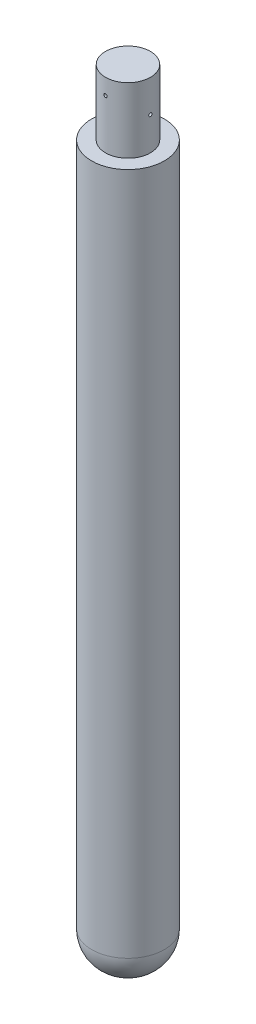
ISO-10303-21;
HEADER;
FILE_DESCRIPTION(('STEP AP214'),'2;1');
FILE_NAME('part.step','',(''),(''),'','','');
FILE_SCHEMA(('AUTOMOTIVE_DESIGN { 1 0 10303 214 1 1 1 1 }'));
ENDSEC;
DATA;
#1=APPLICATION_CONTEXT('core data for automotive mechanical design processes');
#2=APPLICATION_PROTOCOL_DEFINITION('international standard','automotive_design',2000,#1);
#3=PRODUCT_CONTEXT('',#1,'mechanical');
#4=PRODUCT('Part','Part','',(#3));
#5=PRODUCT_RELATED_PRODUCT_CATEGORY('part','',(#4));
#6=PRODUCT_DEFINITION_FORMATION('','',#4);
#7=PRODUCT_DEFINITION_CONTEXT('part definition',#1,'design');
#8=PRODUCT_DEFINITION('design','',#6,#7);
#9=PRODUCT_DEFINITION_SHAPE('','',#8);
#10=(LENGTH_UNIT() NAMED_UNIT(*) SI_UNIT(.MILLI.,.METRE.));
#11=(NAMED_UNIT(*) PLANE_ANGLE_UNIT() SI_UNIT($,.RADIAN.));
#12=(NAMED_UNIT(*) SI_UNIT($,.STERADIAN.) SOLID_ANGLE_UNIT());
#13=UNCERTAINTY_MEASURE_WITH_UNIT(LENGTH_MEASURE(1.E-05),#10,'distance_accuracy_value','');
#14=(GEOMETRIC_REPRESENTATION_CONTEXT(3) GLOBAL_UNCERTAINTY_ASSIGNED_CONTEXT((#13)) GLOBAL_UNIT_ASSIGNED_CONTEXT((#10,
#11,#12)) REPRESENTATION_CONTEXT('',''));
#15=CARTESIAN_POINT('',(0.,0.,0.));
#16=DIRECTION('',(0.,0.,1.));
#17=DIRECTION('',(1.,0.,0.));
#18=AXIS2_PLACEMENT_3D('',#15,#16,#17);
#19=CARTESIAN_POINT('',(0.,236.46667,0.));
#20=DIRECTION('',(0.,-1.,0.));
#21=DIRECTION('',(0.,0.,-1.));
#22=AXIS2_PLACEMENT_3D('',#19,#20,#21);
#23=CYLINDRICAL_SURFACE('',#22,6.8);
#24=CARTESIAN_POINT('',(-6.78159273327439,226.66667,-0.500000000000003));
#25=CARTESIAN_POINT('',(-6.78159297837757,226.6947144594,-0.499998770231773));
#26=CARTESIAN_POINT('',(-6.78176856677654,226.722778286839,-0.497632591546759));
#27=CARTESIAN_POINT('',(-6.78245198649018,226.778130251371,-0.488227838713539));
#28=CARTESIAN_POINT('',(-6.78296019944658,226.805417459827,-0.481183897328644));
#29=CARTESIAN_POINT('',(-6.78425099555627,226.858406442766,-0.462627731505162));
#30=CARTESIAN_POINT('',(-6.78503342856656,226.884109075812,-0.45111795186696));
#31=CARTESIAN_POINT('',(-6.78678431460583,226.933211144203,-0.423960985491659));
#32=CARTESIAN_POINT('',(-6.78775272642473,226.956611088056,-0.408314715049562));
#33=CARTESIAN_POINT('',(-6.78976866583827,227.000497428313,-0.373294420232593));
#34=CARTESIAN_POINT('',(-6.79081633232312,227.020978519599,-0.353913755066674));
#35=CARTESIAN_POINT('',(-6.79287145399055,227.058400269882,-0.311988733735704));
#36=CARTESIAN_POINT('',(-6.79387890745549,227.075340777778,-0.289444242616633));
#37=CARTESIAN_POINT('',(-6.79574135636166,227.105217562981,-0.241800601139886));
#38=CARTESIAN_POINT('',(-6.79659617984393,227.118149335811,-0.216698618778854));
#39=CARTESIAN_POINT('',(-6.79805556933641,227.139612743824,-0.164672353745901));
#40=CARTESIAN_POINT('',(-6.79866013886455,227.148144440863,-0.137748096696646));
#41=CARTESIAN_POINT('',(-6.79954993521933,227.160550477922,-0.0828936605519977));
#42=CARTESIAN_POINT('',(-6.79983574266283,227.164433286724,-0.0549654063471341));
#43=CARTESIAN_POINT('',(-6.80005777399104,227.167457495318,0.00114779135176697));
#44=CARTESIAN_POINT('',(-6.79999400308205,227.166598965722,0.0293327310167222));
#45=CARTESIAN_POINT('',(-6.79952454466821,227.160171822787,0.0851018411694216));
#46=CARTESIAN_POINT('',(-6.79911951834028,227.154612317439,0.112687067651171));
#47=CARTESIAN_POINT('',(-6.79801388751421,227.138955185032,0.166531741703012));
#48=CARTESIAN_POINT('',(-6.79731328073735,227.128857522987,0.192791179050389));
#49=CARTESIAN_POINT('',(-6.79569420149225,227.104400479208,0.243267979866799));
#50=CARTESIAN_POINT('',(-6.79477551941266,227.09003699386,0.267483348055107));
#51=CARTESIAN_POINT('',(-6.79282360632603,227.057459011694,0.313162842512627));
#52=CARTESIAN_POINT('',(-6.79179037351871,227.039244454349,0.334626925531555));
#53=CARTESIAN_POINT('',(-6.78972267451368,226.999429985177,0.374247769142871));
#54=CARTESIAN_POINT('',(-6.78868821118392,226.977822163606,0.392396582431207));
#55=CARTESIAN_POINT('',(-6.78673711523689,226.931862171376,0.424810372711896));
#56=CARTESIAN_POINT('',(-6.78582048268846,226.907509999112,0.43907534743491));
#57=CARTESIAN_POINT('',(-6.78420861400634,226.856747260943,0.463316094783634));
#58=CARTESIAN_POINT('',(-6.78351339713152,226.83033651623,0.473291494325563));
#59=CARTESIAN_POINT('',(-6.78242339907657,226.776208823244,0.488664243993162));
#60=CARTESIAN_POINT('',(-6.7820286129932,226.748491896297,0.494061668834622));
#61=CARTESIAN_POINT('',(-6.78158492474778,226.692608051427,0.500115276160827));
#62=CARTESIAN_POINT('',(-6.78153521539852,226.664442338217,0.500782523331512));
#63=CARTESIAN_POINT('',(-6.78178517593299,226.60839942571,0.497385780829759));
#64=CARTESIAN_POINT('',(-6.78208484328886,226.580522224328,0.493321825389036));
#65=CARTESIAN_POINT('',(-6.78299905331064,226.525879190008,0.480587245964444));
#66=CARTESIAN_POINT('',(-6.78361324534929,226.499112155315,0.471921751308704));
#67=CARTESIAN_POINT('',(-6.78508700233736,226.447412112612,0.450235279473719));
#68=CARTESIAN_POINT('',(-6.78594657036215,226.422479127592,0.437214247704794));
#69=CARTESIAN_POINT('',(-6.78781617977533,226.375104209245,0.407158182314458));
#70=CARTESIAN_POINT('',(-6.78882649706358,226.35266697787,0.390115754806744));
#71=CARTESIAN_POINT('',(-6.79088281220847,226.310967920048,0.352511390028029));
#72=CARTESIAN_POINT('',(-6.79192881054459,226.291706136291,0.331949405448091));
#73=CARTESIAN_POINT('',(-6.79394100886642,226.256867175691,0.287841888640223));
#74=CARTESIAN_POINT('',(-6.79490705113871,226.241297173206,0.264290681464511));
#75=CARTESIAN_POINT('',(-6.79664822050773,226.214332907777,0.214901657852376));
#76=CARTESIAN_POINT('',(-6.79742334914581,226.202938611121,0.189063859879152));
#77=CARTESIAN_POINT('',(-6.7986946168929,226.184661601532,0.135861139830734));
#78=CARTESIAN_POINT('',(-6.79919103352641,226.177774399572,0.108497766791575));
#79=CARTESIAN_POINT('',(-6.7998500618275,226.168692400326,0.0529992515100641));
#80=CARTESIAN_POINT('',(-6.80001267827624,226.16649753583,0.0248641203277486));
#81=CARTESIAN_POINT('',(-6.79998579508498,226.166863226587,-0.0313083985646522));
#82=CARTESIAN_POINT('',(-6.79979712504935,226.169412577808,-0.059345860296129));
#83=CARTESIAN_POINT('',(-6.79909051843197,226.179171036077,-0.114593381986072));
#84=CARTESIAN_POINT('',(-6.79857258132922,226.1863801505,-0.141803440635282));
#85=CARTESIAN_POINT('',(-6.79726560326606,226.205250795847,-0.194624944412667));
#86=CARTESIAN_POINT('',(-6.79647657014824,226.216912197971,-0.220236435760865));
#87=CARTESIAN_POINT('',(-6.79471583354579,226.244355010418,-0.269139744831946));
#88=CARTESIAN_POINT('',(-6.79374413388129,226.260136334581,-0.292431611050076));
#89=CARTESIAN_POINT('',(-6.79172451801548,226.295412890635,-0.336091669932223));
#90=CARTESIAN_POINT('',(-6.7906764362776,226.314916346633,-0.356453209880313));
#91=CARTESIAN_POINT('',(-6.78862356662167,226.357070065518,-0.393621074326443));
#92=CARTESIAN_POINT('',(-6.78761878930475,226.379721093277,-0.410426532172276));
#93=CARTESIAN_POINT('',(-6.78576458384905,226.42756169053,-0.440022648082056));
#94=CARTESIAN_POINT('',(-6.78491539882182,226.452755138886,-0.452807045234638));
#95=CARTESIAN_POINT('',(-6.78347155374233,226.504919460085,-0.473948321363642));
#96=CARTESIAN_POINT('',(-6.78287659844061,226.531888228904,-0.482310338964581));
#97=CARTESIAN_POINT('',(-6.78216306649953,226.576960950742,-0.492217618601718));
#98=CARTESIAN_POINT('',(-6.78195016075426,226.594774246929,-0.495132185938419));
#99=CARTESIAN_POINT('',(-6.78166491548103,226.630612359725,-0.499023770068944));
#100=CARTESIAN_POINT('',(-6.78159257567097,226.648637175909,-0.500000790751353));
#101=CARTESIAN_POINT('',(-6.78159273327439,226.66667,-0.500000000000003));
#102=B_SPLINE_CURVE_WITH_KNOTS('',3,(#24,#25,#26,#27,#28,#29,#30,#31,#32,#33,#34,#35,#36,#37,
#38,#39,#40,#41,#42,#43,#44,#45,#46,#47,#48,#49,#50,#51,#52,#53,#54,#55,#56,#57,#58,#59,#60,#61,
#62,#63,#64,#65,#66,#67,#68,#69,#70,#71,#72,#73,#74,#75,#76,#77,#78,#79,#80,#81,#82,#83,#84,#85,
#86,#87,#88,#89,#90,#91,#92,#93,#94,#95,#96,#97,#98,#99,#100,#101),.UNSPECIFIED.,.T.,.F.,(4,2,2,
2,2,2,2,2,2,2,2,2,2,2,2,2,2,2,2,2,2,2,2,2,2,2,2,2,2,2,2,2,2,2,2,2,2,2,4),(0.,0.084067542244147,
0.168231710124494,0.25234986762154,0.33644940726993,0.420699902967313,0.50495399348977,
0.589302417128914,0.673649655006859,0.757843004383307,0.842035099863553,0.9260644486161,
1.01009444519175,1.09420553978808,1.17831795645116,1.26262943303786,1.34694095888795,
1.43125981621085,1.51557729736375,1.59969748038507,1.68381705477462,1.7678430574443,
1.85187011328479,1.93605288503218,2.02023678843055,2.10458297232425,2.18892847522237,
2.27318984236082,2.35745000258294,2.44151142487004,2.52557298016638,2.60963210383002,
2.69368946974239,2.77793475820918,2.86220055449528,2.94659691296704,3.03089498965295,
3.08495123733824,3.13900737653456),.UNSPECIFIED.);
#103=CARTESIAN_POINT('',(-6.78159273327439,226.66667,-0.500000000000003));
#104=VERTEX_POINT('',#103);
#105=EDGE_CURVE('E116',#104,#104,#102,.T.);
#106=ORIENTED_EDGE('',*,*,#105,.T.);
#107=EDGE_LOOP('',(#106));
#108=FACE_BOUND('',#107,.T.);
#109=CARTESIAN_POINT('',(0.,232.16667,-6.8));
#110=CARTESIAN_POINT('',(-0.0280445749603988,232.166668770336,-6.7999997573507));
#111=CARTESIAN_POINT('',(-0.0561085175768542,232.16430257281,-6.79982465525674));
#112=CARTESIAN_POINT('',(-0.111460721427836,232.154897738334,-6.7991429730326));
#113=CARTESIAN_POINT('',(-0.138748054114419,232.147853734541,-6.79863601217077));
#114=CARTESIAN_POINT('',(-0.191737299690093,232.129297386137,-6.79734793276696));
#115=CARTESIAN_POINT('',(-0.217440070088096,232.117787483353,-6.79656696406701));
#116=CARTESIAN_POINT('',(-0.266542368418331,232.09063022702,-6.79481857968268));
#117=CARTESIAN_POINT('',(-0.289942405030519,232.074983790069,-6.79385120531611));
#118=CARTESIAN_POINT('',(-0.333828639715717,232.039963327401,-6.79183647283731));
#119=CARTESIAN_POINT('',(-0.354309562247897,232.020582698058,-6.79078897504196));
#120=CARTESIAN_POINT('',(-0.391730987072271,231.978657819116,-6.78873323672079));
#121=CARTESIAN_POINT('',(-0.408671337745742,231.956113434104,-6.78772499787767));
#122=CARTESIAN_POINT('',(-0.438547959189983,231.908469884771,-6.78586035990913));
#123=CARTESIAN_POINT('',(-0.451479696425917,231.883367870207,-6.78500413316556));
#124=CARTESIAN_POINT('',(-0.472943029739613,231.83134153516,-6.78354194311983));
#125=CARTESIAN_POINT('',(-0.481474688098939,231.804417240476,-6.78293597627536));
#126=CARTESIAN_POINT('',(-0.493880643373556,231.749562692463,-6.78204400808108));
#127=CARTESIAN_POINT('',(-0.497763406015041,231.72163436336,-6.78175742519321));
#128=CARTESIAN_POINT('',(-0.500787496340066,231.665521019259,-6.78153480408504));
#129=CARTESIAN_POINT('',(-0.499928895129025,231.637336008118,-6.78159876060777));
#130=CARTESIAN_POINT('',(-0.493501639519712,231.581567215702,-6.78206946645491));
#131=CARTESIAN_POINT('',(-0.487942165181557,231.553982370017,-6.78247554765846));
#132=CARTESIAN_POINT('',(-0.472285227066322,231.500138441572,-6.78358369429947));
#133=CARTESIAN_POINT('',(-0.462187727608019,231.473879369238,-6.7842857620642));
#134=CARTESIAN_POINT('',(-0.437731019011254,231.423403008138,-6.78590753973363));
#135=CARTESIAN_POINT('',(-0.423367668081685,231.399187733209,-6.78682746097947));
#136=CARTESIAN_POINT('',(-0.390789972023455,231.353508368124,-6.78878108294084));
#137=CARTESIAN_POINT('',(-0.37257556644531,231.332044321161,-6.78981478544226));
#138=CARTESIAN_POINT('',(-0.332761204047051,231.292423303474,-6.79188245893446));
#139=CARTESIAN_POINT('',(-0.311153306722498,231.274274310773,-6.79291642472856));
#140=CARTESIAN_POINT('',(-0.265193099321131,231.241860194727,-6.79486576445203));
#141=CARTESIAN_POINT('',(-0.240840787898321,231.227595073288,-6.79578113832322));
#142=CARTESIAN_POINT('',(-0.190078013898727,231.203354220721,-6.7973902718425));
#143=CARTESIAN_POINT('',(-0.163667394385234,231.193378817045,-6.79808401457162));
#144=CARTESIAN_POINT('',(-0.109539973256545,231.17800602066,-6.79917150756881));
#145=CARTESIAN_POINT('',(-0.0818231927531159,231.172608553984,-6.79956526268389));
#146=CARTESIAN_POINT('',(-0.0259394130302525,231.16655478915,-6.80000779038889));
#147=CARTESIAN_POINT('',(0.00222638578840572,231.165887465887,-6.80005736519501));
#148=CARTESIAN_POINT('',(0.0582694878581489,231.169284086769,-6.7998080844804));
#149=CARTESIAN_POINT('',(0.0861467931953048,231.173347996678,-6.7995092314809));
#150=CARTESIAN_POINT('',(0.140790329535984,231.186082591088,-6.79859723751832));
#151=CARTESIAN_POINT('',(0.167557751642031,231.194748191555,-6.79798444342941));
#152=CARTESIAN_POINT('',(0.219258522279825,231.216435004951,-6.79651345720742));
#153=CARTESIAN_POINT('',(0.244191848081468,231.229456271847,-6.7956552620337));
#154=CARTESIAN_POINT('',(0.291566994036103,231.259512680716,-6.79378779013311));
#155=CARTESIAN_POINT('',(0.314004150192899,231.276555156781,-6.79277823859589));
#156=CARTESIAN_POINT('',(0.35570303359189,231.31415957568,-6.7907224990085));
#157=CARTESIAN_POINT('',(0.374964717819462,231.33472156618,-6.78967631046227));
#158=CARTESIAN_POINT('',(0.409803469875545,231.378829038597,-6.78766285802961));
#159=CARTESIAN_POINT('',(0.425373364307543,231.402380194596,-6.7866957501515));
#160=CARTESIAN_POINT('',(0.452337440018868,231.451769087663,-6.7849520401822));
#161=CARTESIAN_POINT('',(0.463731654995122,231.477606806276,-6.7841754365537));
#162=CARTESIAN_POINT('',(0.482008609114835,231.530809581722,-6.78290145390941));
#163=CARTESIAN_POINT('',(0.488895801923983,231.558173101702,-6.78240379931693));
#164=CARTESIAN_POINT('',(0.49797773305356,231.613671926358,-6.78174308234527));
#165=CARTESIAN_POINT('',(0.500172539364833,231.641807219845,-6.78158001511807));
#166=CARTESIAN_POINT('',(0.49980668164575,231.697979633648,-6.78160698343512));
#167=CARTESIAN_POINT('',(0.497257291292452,231.726016828486,-6.78179618188783));
#168=CARTESIAN_POINT('',(0.487498848776046,231.781263806782,-6.78250458688444));
#169=CARTESIAN_POINT('',(0.480289788764154,231.808473588845,-6.78302379398421));
#170=CARTESIAN_POINT('',(0.461419353528217,231.861294548091,-6.78433349811063));
#171=CARTESIAN_POINT('',(0.449758108198909,231.886905771887,-6.78512398722244));
#172=CARTESIAN_POINT('',(0.422315691948313,231.935808611481,-6.78688718608591));
#173=CARTESIAN_POINT('',(0.406534606892629,231.959100275609,-6.78785989203968));
#174=CARTESIAN_POINT('',(0.371258310735058,232.002760353658,-6.78988064808406));
#175=CARTESIAN_POINT('',(0.351754821058374,232.023122070953,-6.79092886280742));
#176=CARTESIAN_POINT('',(0.309600962278457,232.060290277448,-6.79298105029926));
#177=CARTESIAN_POINT('',(0.28694982869408,232.077095900457,-6.79398501224161));
#178=CARTESIAN_POINT('',(0.239109148348478,232.106692190583,-6.79583698632853));
#179=CARTESIAN_POINT('',(0.213915741648568,232.119476627395,-6.79668475563937));
#180=CARTESIAN_POINT('',(0.16175150942631,232.140617989274,-6.79812580292224));
#181=CARTESIAN_POINT('',(0.134782787678801,232.14898005238,-6.79871937607323));
#182=CARTESIAN_POINT('',(0.0897099437050886,232.15888746256,-6.79943116279115));
#183=CARTESIAN_POINT('',(0.0718964690761261,232.161802088603,-6.79964351737355));
#184=CARTESIAN_POINT('',(0.0360579986314605,232.165693750741,-6.7999280138518));
#185=CARTESIAN_POINT('',(0.0180330032364081,232.166670790689,-6.80000015602645));
#186=CARTESIAN_POINT('',(0.,232.16667,-6.8));
#187=B_SPLINE_CURVE_WITH_KNOTS('',3,(#109,#110,#111,#112,#113,#114,#115,#116,#117,#118,#119,
#120,#121,#122,#123,#124,#125,#126,#127,#128,#129,#130,#131,#132,#133,#134,#135,#136,#137,#138,
#139,#140,#141,#142,#143,#144,#145,#146,#147,#148,#149,#150,#151,#152,#153,#154,#155,#156,#157,
#158,#159,#160,#161,#162,#163,#164,#165,#166,#167,#168,#169,#170,#171,#172,#173,#174,#175,#176,
#177,#178,#179,#180,#181,#182,#183,#184,#185,#186),.UNSPECIFIED.,.T.,.F.,(4,2,2,2,2,2,2,2,2,2,2,
2,2,2,2,2,2,2,2,2,2,2,2,2,2,2,2,2,2,2,2,2,2,2,2,2,2,2,4),(0.,0.0840678893231214,
0.168232396664332,0.252350949941439,0.336450879298452,0.420700920891872,0.504954569605325,
0.589303160099224,0.673650556635802,0.757844120230297,0.842036421191819,0.926064686643187,
1.01009361279689,1.09420439233831,1.17831649225326,1.26262842369771,1.34694039649302,
1.43125880399685,1.51557584911084,1.5996963016995,1.68381614559494,1.76784324510969,
1.85187138580377,1.936053982515,2.02023771946149,2.10458371465536,2.18892902917837,
2.27319087054905,2.35745149099037,2.44151213780262,2.5255729262076,2.60963126228434,
2.69368784655902,2.77793359697833,2.86219984438567,2.94659601548432,3.03089391612018,
3.08495070024814,3.13900737689175),.UNSPECIFIED.);
#188=CARTESIAN_POINT('',(0.,232.16667,-6.8));
#189=VERTEX_POINT('',#188);
#190=EDGE_CURVE('E67',#189,#189,#187,.T.);
#191=ORIENTED_EDGE('',*,*,#190,.T.);
#192=EDGE_LOOP('',(#191));
#193=FACE_BOUND('',#192,.T.);
#194=CARTESIAN_POINT('',(0.,236.46667,0.));
#195=DIRECTION('',(0.,1.,0.));
#196=DIRECTION('',(0.,0.,1.));
#197=AXIS2_PLACEMENT_3D('',#194,#195,#196);
#198=CIRCLE('',#197,6.8);
#199=CARTESIAN_POINT('',(0.,236.46667,6.8));
#200=VERTEX_POINT('',#199);
#201=EDGE_CURVE('E75',#200,#200,#198,.T.);
#202=ORIENTED_EDGE('',*,*,#201,.F.);
#203=EDGE_LOOP('',(#202));
#204=FACE_BOUND('',#203,.T.);
#205=CARTESIAN_POINT('',(0.,216.66667,0.));
#206=DIRECTION('',(0.,1.,0.));
#207=DIRECTION('',(0.,0.,1.));
#208=AXIS2_PLACEMENT_3D('',#205,#206,#207);
#209=CIRCLE('',#208,6.8);
#210=CARTESIAN_POINT('',(0.,216.66667,6.8));
#211=VERTEX_POINT('',#210);
#212=EDGE_CURVE('E63',#211,#211,#209,.T.);
#213=ORIENTED_EDGE('',*,*,#212,.T.);
#214=EDGE_LOOP('',(#213));
#215=FACE_BOUND('',#214,.T.);
#216=CARTESIAN_POINT('',(-0.5,231.66667,6.78159273327439));
#217=CARTESIAN_POINT('',(-0.49999877023177,231.6386255406,6.78159297837757));
#218=CARTESIAN_POINT('',(-0.497632591546756,231.610561713161,6.78176856677654));
#219=CARTESIAN_POINT('',(-0.488227838713537,231.555209748629,6.78245198649018));
#220=CARTESIAN_POINT('',(-0.481183897328641,231.527922540173,6.78296019944658));
#221=CARTESIAN_POINT('',(-0.462627731505156,231.474933557233,6.78425099555627));
#222=CARTESIAN_POINT('',(-0.451117951866952,231.449230924188,6.78503342856656));
#223=CARTESIAN_POINT('',(-0.423960985491648,231.400128855797,6.78678431460583));
#224=CARTESIAN_POINT('',(-0.408314715049553,231.376728911944,6.78775272642474));
#225=CARTESIAN_POINT('',(-0.373294420232589,231.332842571687,6.78976866583827));
#226=CARTESIAN_POINT('',(-0.353913755066671,231.312361480401,6.79081633232312));
#227=CARTESIAN_POINT('',(-0.3119887337357,231.274939730118,6.79287145399055));
#228=CARTESIAN_POINT('',(-0.289444242616629,231.257999222222,6.79387890745549));
#229=CARTESIAN_POINT('',(-0.241800601139882,231.228122437019,6.79574135636166));
#230=CARTESIAN_POINT('',(-0.216698618778849,231.215190664189,6.79659617984393));
#231=CARTESIAN_POINT('',(-0.164672353745897,231.193727256176,6.79805556933641));
#232=CARTESIAN_POINT('',(-0.137748096696641,231.185195559137,6.79866013886455));
#233=CARTESIAN_POINT('',(-0.0828936605519938,231.172789522078,6.79954993521933));
#234=CARTESIAN_POINT('',(-0.0549654063471307,231.168906713276,6.79983574266283));
#235=CARTESIAN_POINT('',(0.0011477913517696,231.165882504682,6.80005777399104));
#236=CARTESIAN_POINT('',(0.0293327310167243,231.166741034278,6.79999400308205));
#237=CARTESIAN_POINT('',(0.0851018411694225,231.173168177213,6.79952454466821));
#238=CARTESIAN_POINT('',(0.112687067651171,231.178727682561,6.79911951834028));
#239=CARTESIAN_POINT('',(0.166531741703011,231.194384814968,6.79801388751421));
#240=CARTESIAN_POINT('',(0.192791179050388,231.204482477013,6.79731328073735));
#241=CARTESIAN_POINT('',(0.243267979866797,231.228939520792,6.79569420149225));
#242=CARTESIAN_POINT('',(0.267483348055105,231.24330300614,6.79477551941267));
#243=CARTESIAN_POINT('',(0.313162842512624,231.275880988306,6.79282360632603));
#244=CARTESIAN_POINT('',(0.334626925531552,231.294095545651,6.79179037351871));
#245=CARTESIAN_POINT('',(0.374247769142869,231.333910014823,6.78972267451368));
#246=CARTESIAN_POINT('',(0.392396582431204,231.355517836394,6.78868821118392));
#247=CARTESIAN_POINT('',(0.424810372711894,231.401477828624,6.78673711523689));
#248=CARTESIAN_POINT('',(0.439075347434908,231.425830000888,6.78582048268846));
#249=CARTESIAN_POINT('',(0.463316094783635,231.476592739057,6.78420861400633));
#250=CARTESIAN_POINT('',(0.473291494325567,231.50300348377,6.78351339713152));
#251=CARTESIAN_POINT('',(0.488664243993162,231.557131176756,6.78242339907657));
#252=CARTESIAN_POINT('',(0.494061668834621,231.584848103703,6.7820286129932));
#253=CARTESIAN_POINT('',(0.500115276160824,231.640731948573,6.78158492474778));
#254=CARTESIAN_POINT('',(0.500782523331509,231.668897661783,6.78153521539852));
#255=CARTESIAN_POINT('',(0.497385780829757,231.72494057429,6.78178517593299));
#256=CARTESIAN_POINT('',(0.493321825389034,231.752817775672,6.78208484328886));
#257=CARTESIAN_POINT('',(0.480587245964441,231.807460809992,6.78299905331064));
#258=CARTESIAN_POINT('',(0.471921751308701,231.834227844685,6.78361324534929));
#259=CARTESIAN_POINT('',(0.450235279473717,231.885927887388,6.78508700233736));
#260=CARTESIAN_POINT('',(0.437214247704791,231.910860872408,6.78594657036216));
#261=CARTESIAN_POINT('',(0.407158182314461,231.958235790755,6.78781617977533));
#262=CARTESIAN_POINT('',(0.390115754806752,231.98067302213,6.78882649706357));
#263=CARTESIAN_POINT('',(0.352511390028046,232.022372079952,6.79088281220847));
#264=CARTESIAN_POINT('',(0.331949405448111,232.041633863709,6.79192881054459));
#265=CARTESIAN_POINT('',(0.287841888640242,232.076472824309,6.79394100886642));
#266=CARTESIAN_POINT('',(0.264290681464527,232.092042826794,6.79490705113871));
#267=CARTESIAN_POINT('',(0.214901657852383,232.119007092223,6.79664822050773));
#268=CARTESIAN_POINT('',(0.189063859879153,232.130401388879,6.79742334914581));
#269=CARTESIAN_POINT('',(0.135861139830734,232.148678398468,6.7986946168929));
#270=CARTESIAN_POINT('',(0.108497766791579,232.155565600428,6.7991910335264));
#271=CARTESIAN_POINT('',(0.0529992515100745,232.164647599674,6.7998500618275));
#272=CARTESIAN_POINT('',(0.024864120327762,232.16684246417,6.80001267827624));
#273=CARTESIAN_POINT('',(-0.0313083985646384,232.166476773413,6.79998579508498));
#274=CARTESIAN_POINT('',(-0.0593458602961175,232.163927422192,6.79979712504935));
#275=CARTESIAN_POINT('',(-0.114593381986067,232.154168963923,6.79909051843197));
#276=CARTESIAN_POINT('',(-0.141803440635281,232.1469598495,6.79857258132922));
#277=CARTESIAN_POINT('',(-0.194624944412658,232.128089204153,6.79726560326606));
#278=CARTESIAN_POINT('',(-0.220236435760845,232.116427802029,6.79647657014824));
#279=CARTESIAN_POINT('',(-0.269139744831926,232.088984989582,6.79471583354579));
#280=CARTESIAN_POINT('',(-0.292431611050067,232.073203665418,6.79374413388129));
#281=CARTESIAN_POINT('',(-0.336091669932222,232.037927109365,6.79172451801548));
#282=CARTESIAN_POINT('',(-0.356453209880311,232.018423653367,6.7906764362776));
#283=CARTESIAN_POINT('',(-0.39362107432644,231.976269934482,6.78862356662167));
#284=CARTESIAN_POINT('',(-0.410426532172273,231.953618906723,6.78761878930475));
#285=CARTESIAN_POINT('',(-0.440022648082049,231.90577830947,6.78576458384905));
#286=CARTESIAN_POINT('',(-0.452807045234628,231.880584861114,6.78491539882182));
#287=CARTESIAN_POINT('',(-0.473948321363635,231.828420539915,6.78347155374233));
#288=CARTESIAN_POINT('',(-0.482310338964577,231.801451771096,6.78287659844061));
#289=CARTESIAN_POINT('',(-0.492217618601716,231.756379049258,6.78216306649954));
#290=CARTESIAN_POINT('',(-0.495132185938416,231.738565753071,6.78195016075426));
#291=CARTESIAN_POINT('',(-0.499023770068942,231.702727640275,6.78166491548103));
#292=CARTESIAN_POINT('',(-0.500000790751351,231.684702824091,6.78159257567097));
#293=CARTESIAN_POINT('',(-0.5,231.66667,6.78159273327439));
#294=B_SPLINE_CURVE_WITH_KNOTS('',3,(#216,#217,#218,#219,#220,#221,#222,#223,#224,#225,#226,
#227,#228,#229,#230,#231,#232,#233,#234,#235,#236,#237,#238,#239,#240,#241,#242,#243,#244,#245,
#246,#247,#248,#249,#250,#251,#252,#253,#254,#255,#256,#257,#258,#259,#260,#261,#262,#263,#264,
#265,#266,#267,#268,#269,#270,#271,#272,#273,#274,#275,#276,#277,#278,#279,#280,#281,#282,#283,
#284,#285,#286,#287,#288,#289,#290,#291,#292,#293),.UNSPECIFIED.,.T.,.F.,(4,2,2,2,2,2,2,2,2,2,2,
2,2,2,2,2,2,2,2,2,2,2,2,2,2,2,2,2,2,2,2,2,2,2,2,2,2,2,4),(0.,0.084067542244147,
0.168231710124494,0.252349867621571,0.336449407269931,0.420699902967314,0.504953993489772,
0.589302417128916,0.673649655006861,0.757843004383308,0.842035099863552,0.926064448616097,
1.01009444519175,1.09420553978807,1.17831795645115,1.26262943303785,1.34694095888794,
1.43125981621087,1.51557729736374,1.59969748038506,1.68381705477462,1.7678430574443,
1.85187011328479,1.93605288503215,2.0202367884305,2.10458297232424,2.18892847522236,
2.2731898423608,2.35745000258291,2.44151142487003,2.52557298016637,2.60963210382999,
2.69368946974238,2.77793475820917,2.86220055449527,2.94659691296699,3.03089498965293,
3.08495123733822,3.13900737653455),.UNSPECIFIED.);
#295=CARTESIAN_POINT('',(-0.5,231.66667,6.78159273327439));
#296=VERTEX_POINT('',#295);
#297=EDGE_CURVE('E77',#296,#296,#294,.T.);
#298=ORIENTED_EDGE('',*,*,#297,.F.);
#299=EDGE_LOOP('',(#298));
#300=FACE_BOUND('',#299,.T.);
#301=CARTESIAN_POINT('',(6.78159273327439,226.66667,0.500000000000003));
#302=CARTESIAN_POINT('',(6.78159297837757,226.6386255406,0.499998770231773));
#303=CARTESIAN_POINT('',(6.78176856677654,226.610561713161,0.497632591546759));
#304=CARTESIAN_POINT('',(6.78245198649018,226.555209748629,0.488227838713539));
#305=CARTESIAN_POINT('',(6.78296019944658,226.527922540173,0.481183897328644));
#306=CARTESIAN_POINT('',(6.78425099555628,226.474933557233,0.462627731505151));
#307=CARTESIAN_POINT('',(6.78503342856656,226.449230924188,0.451117951866933));
#308=CARTESIAN_POINT('',(6.78678431460584,226.400128855797,0.423960985491622));
#309=CARTESIAN_POINT('',(6.78775272642474,226.376728911944,0.408314715049541));
#310=CARTESIAN_POINT('',(6.78976866583827,226.332842571687,0.373294420232593));
#311=CARTESIAN_POINT('',(6.79081633232312,226.312361480401,0.353913755066674));
#312=CARTESIAN_POINT('',(6.79287145399055,226.274939730118,0.311988733735704));
#313=CARTESIAN_POINT('',(6.79387890745549,226.257999222222,0.289444242616633));
#314=CARTESIAN_POINT('',(6.79574135636166,226.228122437019,0.241800601139886));
#315=CARTESIAN_POINT('',(6.79659617984393,226.215190664189,0.216698618778854));
#316=CARTESIAN_POINT('',(6.79805556933641,226.193727256176,0.164672353745901));
#317=CARTESIAN_POINT('',(6.79866013886455,226.185195559137,0.137748096696646));
#318=CARTESIAN_POINT('',(6.79954993521933,226.172789522078,0.0828936605519977));
#319=CARTESIAN_POINT('',(6.79983574266283,226.168906713276,0.0549654063471342));
#320=CARTESIAN_POINT('',(6.80005777399104,226.165882504682,-0.00114779135176701));
#321=CARTESIAN_POINT('',(6.79999400308205,226.166741034278,-0.0293327310167223));
#322=CARTESIAN_POINT('',(6.79952454466821,226.173168177213,-0.0851018411694215));
#323=CARTESIAN_POINT('',(6.79911951834028,226.178727682561,-0.11268706765117));
#324=CARTESIAN_POINT('',(6.79801388751421,226.194384814968,-0.166531741703012));
#325=CARTESIAN_POINT('',(6.79731328073735,226.204482477013,-0.192791179050391));
#326=CARTESIAN_POINT('',(6.79569420149225,226.228939520792,-0.243267979866804));
#327=CARTESIAN_POINT('',(6.79477551941266,226.24330300614,-0.267483348055114));
#328=CARTESIAN_POINT('',(6.79282360632603,226.275880988306,-0.313162842512632));
#329=CARTESIAN_POINT('',(6.79179037351871,226.294095545651,-0.334626925531559));
#330=CARTESIAN_POINT('',(6.78972267451368,226.333910014823,-0.374247769142874));
#331=CARTESIAN_POINT('',(6.78868821118392,226.355517836394,-0.392396582431207));
#332=CARTESIAN_POINT('',(6.78673711523689,226.401477828624,-0.424810372711896));
#333=CARTESIAN_POINT('',(6.78582048268846,226.425830000888,-0.43907534743491));
#334=CARTESIAN_POINT('',(6.78420861400634,226.476592739057,-0.463316094783634));
#335=CARTESIAN_POINT('',(6.78351339713152,226.50300348377,-0.473291494325563));
#336=CARTESIAN_POINT('',(6.78242339907657,226.557131176756,-0.488664243993161));
#337=CARTESIAN_POINT('',(6.7820286129932,226.584848103703,-0.494061668834622));
#338=CARTESIAN_POINT('',(6.78158492474778,226.640731948573,-0.500115276160827));
#339=CARTESIAN_POINT('',(6.78153521539852,226.668897661783,-0.500782523331512));
#340=CARTESIAN_POINT('',(6.78178517593299,226.72494057429,-0.497385780829759));
#341=CARTESIAN_POINT('',(6.78208484328886,226.752817775672,-0.493321825389036));
#342=CARTESIAN_POINT('',(6.78299905331064,226.807460809992,-0.480587245964444));
#343=CARTESIAN_POINT('',(6.78361324534929,226.834227844685,-0.471921751308704));
#344=CARTESIAN_POINT('',(6.78508700233736,226.885927887388,-0.450235279473719));
#345=CARTESIAN_POINT('',(6.78594657036215,226.910860872408,-0.437214247704792));
#346=CARTESIAN_POINT('',(6.78781617977533,226.958235790755,-0.407158182314454));
#347=CARTESIAN_POINT('',(6.78882649706358,226.98067302213,-0.390115754806738));
#348=CARTESIAN_POINT('',(6.79088281220847,227.022372079952,-0.35251139002802));
#349=CARTESIAN_POINT('',(6.79192881054459,227.041633863709,-0.331949405448085));
#350=CARTESIAN_POINT('',(6.79394100886642,227.076472824309,-0.287841888640221));
#351=CARTESIAN_POINT('',(6.79490705113871,227.092042826794,-0.264290681464511));
#352=CARTESIAN_POINT('',(6.79664822050773,227.119007092223,-0.214901657852377));
#353=CARTESIAN_POINT('',(6.79742334914581,227.130401388879,-0.189063859879152));
#354=CARTESIAN_POINT('',(6.7986946168929,227.148678398468,-0.135861139830734));
#355=CARTESIAN_POINT('',(6.79919103352641,227.155565600428,-0.108497766791575));
#356=CARTESIAN_POINT('',(6.7998500618275,227.164647599674,-0.0529992515100641));
#357=CARTESIAN_POINT('',(6.80001267827624,227.16684246417,-0.0248641203277486));
#358=CARTESIAN_POINT('',(6.79998579508498,227.166476773413,0.031308398564654));
#359=CARTESIAN_POINT('',(6.79979712504935,227.163927422192,0.0593458602961324));
#360=CARTESIAN_POINT('',(6.79909051843197,227.154168963923,0.114593381986076));
#361=CARTESIAN_POINT('',(6.79857258132922,227.1469598495,0.141803440635284));
#362=CARTESIAN_POINT('',(6.79726560326606,227.128089204153,0.194624944412668));
#363=CARTESIAN_POINT('',(6.79647657014824,227.116427802029,0.220236435760865));
#364=CARTESIAN_POINT('',(6.79471583354579,227.088984989582,0.269139744831946));
#365=CARTESIAN_POINT('',(6.79374413388129,227.073203665418,0.292431611050076));
#366=CARTESIAN_POINT('',(6.79172451801548,227.037927109365,0.336091669932223));
#367=CARTESIAN_POINT('',(6.7906764362776,227.018423653367,0.356453209880313));
#368=CARTESIAN_POINT('',(6.78862356662167,226.976269934482,0.393621074326443));
#369=CARTESIAN_POINT('',(6.78761878930475,226.953618906723,0.410426532172276));
#370=CARTESIAN_POINT('',(6.78576458384905,226.90577830947,0.440022648082051));
#371=CARTESIAN_POINT('',(6.78491539882182,226.880584861114,0.452807045234631));
#372=CARTESIAN_POINT('',(6.78347155374233,226.828420539915,0.473948321363638));
#373=CARTESIAN_POINT('',(6.78287659844061,226.801451771096,0.48231033896458));
#374=CARTESIAN_POINT('',(6.78216306649953,226.756379049258,0.492217618601718));
#375=CARTESIAN_POINT('',(6.78195016075426,226.738565753071,0.495132185938419));
#376=CARTESIAN_POINT('',(6.78166491548103,226.702727640275,0.499023770068945));
#377=CARTESIAN_POINT('',(6.78159257567097,226.684702824091,0.500000790751354));
#378=CARTESIAN_POINT('',(6.78159273327439,226.66667,0.500000000000003));
#379=B_SPLINE_CURVE_WITH_KNOTS('',3,(#301,#302,#303,#304,#305,#306,#307,#308,#309,#310,#311,
#312,#313,#314,#315,#316,#317,#318,#319,#320,#321,#322,#323,#324,#325,#326,#327,#328,#329,#330,
#331,#332,#333,#334,#335,#336,#337,#338,#339,#340,#341,#342,#343,#344,#345,#346,#347,#348,#349,
#350,#351,#352,#353,#354,#355,#356,#357,#358,#359,#360,#361,#362,#363,#364,#365,#366,#367,#368,
#369,#370,#371,#372,#373,#374,#375,#376,#377,#378),.UNSPECIFIED.,.T.,.F.,(4,2,2,2,2,2,2,2,2,2,2,
2,2,2,2,2,2,2,2,2,2,2,2,2,2,2,2,2,2,2,2,2,2,2,2,2,2,2,4),(0.,0.084067542244147,
0.168231710124494,0.252349867621636,0.33644940726993,0.420699902967313,0.50495399348977,
0.589302417128914,0.673649655006859,0.757843004383307,0.842035099863552,0.9260644486161,
1.01009444519175,1.0942055397881,1.17831795645116,1.26262943303785,1.34694095888795,
1.43125981621084,1.51557729736375,1.59969748038506,1.68381705477462,1.7678430574443,
1.85187011328479,1.93605288503221,2.02023678843054,2.10458297232425,2.18892847522237,
2.27318984236082,2.35745000258294,2.44151142487004,2.52557298016638,2.60963210383002,
2.69368946974239,2.77793475820918,2.86220055449528,2.94659691296701,3.03089498965295,
3.08495123733824,3.13900737653456),.UNSPECIFIED.);
#380=CARTESIAN_POINT('',(6.78159273327439,226.66667,0.500000000000003));
#381=VERTEX_POINT('',#380);
#382=EDGE_CURVE('E47',#381,#381,#379,.T.);
#383=ORIENTED_EDGE('',*,*,#382,.F.);
#384=EDGE_LOOP('',(#383));
#385=FACE_BOUND('',#384,.T.);
#386=ADVANCED_FACE('F43',(#108,#193,#204,#215,#300,#385),#23,.T.);
#387=CARTESIAN_POINT('',(0.,216.66667,0.));
#388=DIRECTION('',(0.,-1.,0.));
#389=DIRECTION('',(0.,0.,-1.));
#390=AXIS2_PLACEMENT_3D('',#387,#388,#389);
#391=CYLINDRICAL_SURFACE('',#390,11.);
#392=CARTESIAN_POINT('',(0.,10.,0.));
#393=DIRECTION('',(0.,1.,0.));
#394=DIRECTION('',(0.,0.,1.));
#395=AXIS2_PLACEMENT_3D('',#392,#393,#394);
#396=CIRCLE('',#395,11.);
#397=CARTESIAN_POINT('',(0.,10.,11.));
#398=VERTEX_POINT('',#397);
#399=EDGE_CURVE('E57',#398,#398,#396,.T.);
#400=ORIENTED_EDGE('',*,*,#399,.T.);
#401=EDGE_LOOP('',(#400));
#402=FACE_BOUND('',#401,.T.);
#403=CARTESIAN_POINT('',(0.,216.66667,0.));
#404=DIRECTION('',(0.,1.,0.));
#405=DIRECTION('',(0.,0.,1.));
#406=AXIS2_PLACEMENT_3D('',#403,#404,#405);
#407=CIRCLE('',#406,11.);
#408=CARTESIAN_POINT('',(0.,216.66667,11.));
#409=VERTEX_POINT('',#408);
#410=EDGE_CURVE('E151',#409,#409,#407,.T.);
#411=ORIENTED_EDGE('',*,*,#410,.F.);
#412=EDGE_LOOP('',(#411));
#413=FACE_BOUND('',#412,.T.);
#414=ADVANCED_FACE('F106',(#402,#413),#391,.T.);
#415=CARTESIAN_POINT('',(0.,216.66667,0.));
#416=DIRECTION('',(0.,1.,0.));
#417=DIRECTION('',(0.,0.,1.));
#418=AXIS2_PLACEMENT_3D('',#415,#416,#417);
#419=PLANE('',#418);
#420=ORIENTED_EDGE('',*,*,#212,.F.);
#421=EDGE_LOOP('',(#420));
#422=FACE_BOUND('',#421,.T.);
#423=ORIENTED_EDGE('',*,*,#410,.T.);
#424=EDGE_LOOP('',(#423));
#425=FACE_BOUND('',#424,.T.);
#426=ADVANCED_FACE('F102',(#422,#425),#419,.T.);
#427=CARTESIAN_POINT('',(0.,0.,0.));
#428=DIRECTION('',(0.,1.,0.));
#429=DIRECTION('',(0.,0.,1.));
#430=AXIS2_PLACEMENT_3D('',#427,#428,#429);
#431=PLANE('',#430);
#432=CARTESIAN_POINT('',(0.,0.,0.));
#433=DIRECTION('',(0.,1.,0.));
#434=DIRECTION('',(0.,0.,1.));
#435=AXIS2_PLACEMENT_3D('',#432,#433,#434);
#436=CIRCLE('',#435,0.999999999999999);
#437=CARTESIAN_POINT('',(0.,0.,0.999999999999999));
#438=VERTEX_POINT('',#437);
#439=EDGE_CURVE('E10',#438,#438,#436,.F.);
#440=ORIENTED_EDGE('',*,*,#439,.T.);
#441=EDGE_LOOP('',(#440));
#442=FACE_BOUND('',#441,.T.);
#443=ADVANCED_FACE('F93',(#442),#431,.F.);
#444=CARTESIAN_POINT('',(0.,236.46667,0.));
#445=DIRECTION('',(0.,1.,0.));
#446=DIRECTION('',(0.,0.,1.));
#447=AXIS2_PLACEMENT_3D('',#444,#445,#446);
#448=PLANE('',#447);
#449=ORIENTED_EDGE('',*,*,#201,.T.);
#450=EDGE_LOOP('',(#449));
#451=FACE_BOUND('',#450,.T.);
#452=ADVANCED_FACE('F91',(#451),#448,.T.);
#453=CARTESIAN_POINT('',(0.,10.,0.));
#454=DIRECTION('',(0.,1.,0.));
#455=DIRECTION('',(0.,0.,1.));
#456=AXIS2_PLACEMENT_3D('',#453,#454,#455);
#457=DEGENERATE_TOROIDAL_SURFACE('',#456,0.999999999999999,10.,.T.);
#458=ORIENTED_EDGE('',*,*,#439,.F.);
#459=EDGE_LOOP('',(#458));
#460=FACE_BOUND('',#459,.T.);
#461=ORIENTED_EDGE('',*,*,#399,.F.);
#462=EDGE_LOOP('',(#461));
#463=FACE_BOUND('',#462,.T.);
#464=ADVANCED_FACE('F45',(#460,#463),#457,.T.);
#465=CARTESIAN_POINT('',(0.,231.66667,-10.44));
#466=DIRECTION('',(0.,0.,1.));
#467=DIRECTION('',(1.,0.,0.));
#468=AXIS2_PLACEMENT_3D('',#465,#466,#467);
#469=CYLINDRICAL_SURFACE('',#468,0.5);
#470=CARTESIAN_POINT('',(0.,231.66667,-1.44));
#471=DIRECTION('',(0.,0.,1.));
#472=DIRECTION('',(1.,0.,0.));
#473=AXIS2_PLACEMENT_3D('',#470,#471,#472);
#474=CIRCLE('',#473,0.5);
#475=CARTESIAN_POINT('',(0.5,231.66667,-1.44));
#476=VERTEX_POINT('',#475);
#477=EDGE_CURVE('E76',#476,#476,#474,.T.);
#478=ORIENTED_EDGE('',*,*,#477,.T.);
#479=EDGE_LOOP('',(#478));
#480=FACE_BOUND('',#479,.T.);
#481=ORIENTED_EDGE('',*,*,#190,.F.);
#482=EDGE_LOOP('',(#481));
#483=FACE_BOUND('',#482,.T.);
#484=ADVANCED_FACE('F85',(#480,#483),#469,.F.);
#485=CARTESIAN_POINT('',(0.,231.66667,-1.44));
#486=DIRECTION('',(0.,0.,1.));
#487=DIRECTION('',(1.,0.,0.));
#488=AXIS2_PLACEMENT_3D('',#485,#486,#487);
#489=PLANE('',#488);
#490=ORIENTED_EDGE('',*,*,#477,.F.);
#491=EDGE_LOOP('',(#490));
#492=FACE_BOUND('',#491,.T.);
#493=ADVANCED_FACE('F89',(#492),#489,.F.);
#494=CARTESIAN_POINT('',(0.,231.66667,10.44));
#495=DIRECTION('',(0.,0.,-1.));
#496=DIRECTION('',(-1.,0.,0.));
#497=AXIS2_PLACEMENT_3D('',#494,#495,#496);
#498=CYLINDRICAL_SURFACE('',#497,0.5);
#499=CARTESIAN_POINT('',(0.,231.66667,1.44));
#500=DIRECTION('',(0.,0.,1.));
#501=DIRECTION('',(1.,0.,0.));
#502=AXIS2_PLACEMENT_3D('',#499,#500,#501);
#503=CIRCLE('',#502,0.5);
#504=CARTESIAN_POINT('',(0.5,231.66667,1.44));
#505=VERTEX_POINT('',#504);
#506=EDGE_CURVE('E142',#505,#505,#503,.T.);
#507=ORIENTED_EDGE('',*,*,#506,.F.);
#508=EDGE_LOOP('',(#507));
#509=FACE_BOUND('',#508,.T.);
#510=ORIENTED_EDGE('',*,*,#297,.T.);
#511=EDGE_LOOP('',(#510));
#512=FACE_BOUND('',#511,.T.);
#513=ADVANCED_FACE('F197',(#509,#512),#498,.F.);
#514=CARTESIAN_POINT('',(0.,231.66667,1.44));
#515=DIRECTION('',(0.,0.,-1.));
#516=DIRECTION('',(1.,0.,0.));
#517=AXIS2_PLACEMENT_3D('',#514,#515,#516);
#518=PLANE('',#517);
#519=ORIENTED_EDGE('',*,*,#506,.T.);
#520=EDGE_LOOP('',(#519));
#521=FACE_BOUND('',#520,.T.);
#522=ADVANCED_FACE('F206',(#521),#518,.F.);
#523=CARTESIAN_POINT('',(-10.4,226.66667,0.));
#524=DIRECTION('',(1.,0.,0.));
#525=DIRECTION('',(0.,0.,-1.));
#526=AXIS2_PLACEMENT_3D('',#523,#524,#525);
#527=CYLINDRICAL_SURFACE('',#526,0.500000000000003);
#528=CARTESIAN_POINT('',(-1.4,226.66667,0.));
#529=DIRECTION('',(1.,0.,0.));
#530=DIRECTION('',(0.,0.,-1.));
#531=AXIS2_PLACEMENT_3D('',#528,#529,#530);
#532=CIRCLE('',#531,0.500000000000003);
#533=CARTESIAN_POINT('',(-1.4,226.66667,-0.500000000000003));
#534=VERTEX_POINT('',#533);
#535=EDGE_CURVE('E131',#534,#534,#532,.T.);
#536=ORIENTED_EDGE('',*,*,#535,.T.);
#537=EDGE_LOOP('',(#536));
#538=FACE_BOUND('',#537,.T.);
#539=ORIENTED_EDGE('',*,*,#105,.F.);
#540=EDGE_LOOP('',(#539));
#541=FACE_BOUND('',#540,.T.);
#542=ADVANCED_FACE('F215',(#538,#541),#527,.F.);
#543=CARTESIAN_POINT('',(-1.4,226.66667,0.));
#544=DIRECTION('',(1.,0.,0.));
#545=DIRECTION('',(0.,0.,-1.));
#546=AXIS2_PLACEMENT_3D('',#543,#544,#545);
#547=PLANE('',#546);
#548=ORIENTED_EDGE('',*,*,#535,.F.);
#549=EDGE_LOOP('',(#548));
#550=FACE_BOUND('',#549,.T.);
#551=ADVANCED_FACE('F225',(#550),#547,.F.);
#552=CARTESIAN_POINT('',(10.4,226.66667,0.));
#553=DIRECTION('',(-1.,0.,0.));
#554=DIRECTION('',(0.,0.,1.));
#555=AXIS2_PLACEMENT_3D('',#552,#553,#554);
#556=CYLINDRICAL_SURFACE('',#555,0.500000000000003);
#557=CARTESIAN_POINT('',(1.4,226.66667,0.));
#558=DIRECTION('',(1.,0.,0.));
#559=DIRECTION('',(0.,0.,-1.));
#560=AXIS2_PLACEMENT_3D('',#557,#558,#559);
#561=CIRCLE('',#560,0.500000000000003);
#562=CARTESIAN_POINT('',(1.4,226.66667,-0.500000000000003));
#563=VERTEX_POINT('',#562);
#564=EDGE_CURVE('E132',#563,#563,#561,.T.);
#565=ORIENTED_EDGE('',*,*,#564,.F.);
#566=EDGE_LOOP('',(#565));
#567=FACE_BOUND('',#566,.T.);
#568=ORIENTED_EDGE('',*,*,#382,.T.);
#569=EDGE_LOOP('',(#568));
#570=FACE_BOUND('',#569,.T.);
#571=ADVANCED_FACE('F233',(#567,#570),#556,.F.);
#572=CARTESIAN_POINT('',(1.4,226.66667,0.));
#573=DIRECTION('',(-1.,0.,0.));
#574=DIRECTION('',(0.,0.,-1.));
#575=AXIS2_PLACEMENT_3D('',#572,#573,#574);
#576=PLANE('',#575);
#577=ORIENTED_EDGE('',*,*,#564,.T.);
#578=EDGE_LOOP('',(#577));
#579=FACE_BOUND('',#578,.T.);
#580=ADVANCED_FACE('F247',(#579),#576,.F.);
#581=CLOSED_SHELL('',(#386,#414,#426,#443,#452,#464,#484,#493,#513,#522,#542,#551,#571,#580));
#582=MANIFOLD_SOLID_BREP('B2',#581);
#583=ADVANCED_BREP_SHAPE_REPRESENTATION('',(#18,#582),#14);
#584=SHAPE_DEFINITION_REPRESENTATION(#9,#583);
ENDSEC;
END-ISO-10303-21;
